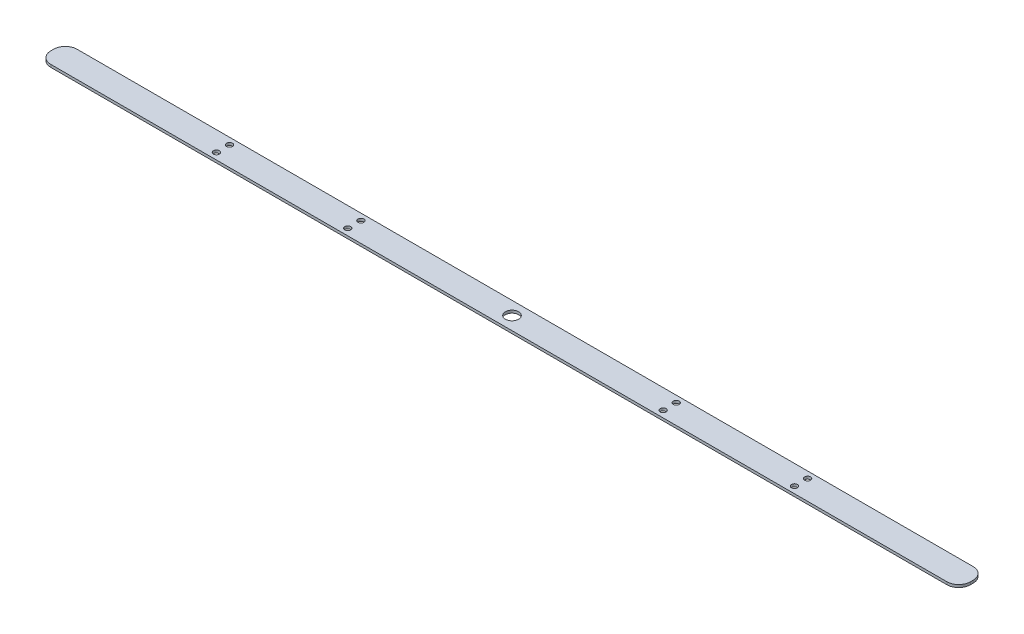
ISO-10303-21;
HEADER;
FILE_DESCRIPTION(('STEP AP214'),'2;1');
FILE_NAME('part.step','',(''),(''),'','','');
FILE_SCHEMA(('AUTOMOTIVE_DESIGN { 1 0 10303 214 1 1 1 1 }'));
ENDSEC;
DATA;
#1=APPLICATION_CONTEXT('core data for automotive mechanical design processes');
#2=APPLICATION_PROTOCOL_DEFINITION('international standard','automotive_design',2000,#1);
#3=PRODUCT_CONTEXT('',#1,'mechanical');
#4=PRODUCT('Part','Part','',(#3));
#5=PRODUCT_RELATED_PRODUCT_CATEGORY('part','',(#4));
#6=PRODUCT_DEFINITION_FORMATION('','',#4);
#7=PRODUCT_DEFINITION_CONTEXT('part definition',#1,'design');
#8=PRODUCT_DEFINITION('design','',#6,#7);
#9=PRODUCT_DEFINITION_SHAPE('','',#8);
#10=(LENGTH_UNIT() NAMED_UNIT(*) SI_UNIT(.MILLI.,.METRE.));
#11=(NAMED_UNIT(*) PLANE_ANGLE_UNIT() SI_UNIT($,.RADIAN.));
#12=(NAMED_UNIT(*) SI_UNIT($,.STERADIAN.) SOLID_ANGLE_UNIT());
#13=UNCERTAINTY_MEASURE_WITH_UNIT(LENGTH_MEASURE(1.E-05),#10,'distance_accuracy_value','');
#14=(GEOMETRIC_REPRESENTATION_CONTEXT(3) GLOBAL_UNCERTAINTY_ASSIGNED_CONTEXT((#13)) GLOBAL_UNIT_ASSIGNED_CONTEXT((#10,
#11,#12)) REPRESENTATION_CONTEXT('',''));
#15=CARTESIAN_POINT('',(0.,0.,0.));
#16=DIRECTION('',(0.,0.,1.));
#17=DIRECTION('',(1.,0.,0.));
#18=AXIS2_PLACEMENT_3D('',#15,#16,#17);
#19=CARTESIAN_POINT('',(0.,2.,0.));
#20=DIRECTION('',(1.,0.,0.));
#21=DIRECTION('',(0.,0.,-1.));
#22=AXIS2_PLACEMENT_3D('',#19,#20,#21);
#23=PLANE('',#22);
#24=DIRECTION('',(0.,0.,1.));
#25=VECTOR('',#24,1.);
#26=CARTESIAN_POINT('',(0.,0.,0.));
#27=LINE('',#26,#25);
#28=CARTESIAN_POINT('',(0.,0.,-11.));
#29=VERTEX_POINT('',#28);
#30=CARTESIAN_POINT('',(0.,0.,-9.));
#31=VERTEX_POINT('',#30);
#32=EDGE_CURVE('E142',#29,#31,#27,.T.);
#33=ORIENTED_EDGE('',*,*,#32,.T.);
#34=DIRECTION('',(0.,-1.,0.));
#35=VECTOR('',#34,1.);
#36=CARTESIAN_POINT('',(0.,2.,-9.));
#37=LINE('',#36,#35);
#38=CARTESIAN_POINT('',(0.,2.,-9.));
#39=VERTEX_POINT('',#38);
#40=EDGE_CURVE('E117',#31,#39,#37,.F.);
#41=ORIENTED_EDGE('',*,*,#40,.T.);
#42=DIRECTION('',(0.,0.,1.));
#43=VECTOR('',#42,1.);
#44=CARTESIAN_POINT('',(0.,2.,0.));
#45=LINE('',#44,#43);
#46=CARTESIAN_POINT('',(0.,2.,-11.));
#47=VERTEX_POINT('',#46);
#48=EDGE_CURVE('E155',#47,#39,#45,.T.);
#49=ORIENTED_EDGE('',*,*,#48,.F.);
#50=DIRECTION('',(0.,-1.,0.));
#51=VECTOR('',#50,1.);
#52=CARTESIAN_POINT('',(0.,2.,-11.));
#53=LINE('',#52,#51);
#54=EDGE_CURVE('E123',#47,#29,#53,.T.);
#55=ORIENTED_EDGE('',*,*,#54,.T.);
#56=EDGE_LOOP('',(#33,#41,#49,#55));
#57=FACE_BOUND('',#56,.T.);
#58=ADVANCED_FACE('F45',(#57),#23,.F.);
#59=CARTESIAN_POINT('',(0.,2.,0.));
#60=DIRECTION('',(0.,0.,-1.));
#61=DIRECTION('',(-1.,0.,0.));
#62=AXIS2_PLACEMENT_3D('',#59,#60,#61);
#63=PLANE('',#62);
#64=DIRECTION('',(1.,0.,0.));
#65=VECTOR('',#64,1.);
#66=CARTESIAN_POINT('',(0.,2.,0.));
#67=LINE('',#66,#65);
#68=CARTESIAN_POINT('',(9.,2.,0.));
#69=VERTEX_POINT('',#68);
#70=CARTESIAN_POINT('',(691.,2.,0.));
#71=VERTEX_POINT('',#70);
#72=EDGE_CURVE('E133',#69,#71,#67,.T.);
#73=ORIENTED_EDGE('',*,*,#72,.F.);
#74=DIRECTION('',(0.,-1.,0.));
#75=VECTOR('',#74,1.);
#76=CARTESIAN_POINT('',(9.,2.,0.));
#77=LINE('',#76,#75);
#78=CARTESIAN_POINT('',(9.,0.,0.));
#79=VERTEX_POINT('',#78);
#80=EDGE_CURVE('E116',#69,#79,#77,.T.);
#81=ORIENTED_EDGE('',*,*,#80,.T.);
#82=DIRECTION('',(1.,0.,0.));
#83=VECTOR('',#82,1.);
#84=CARTESIAN_POINT('',(0.,0.,0.));
#85=LINE('',#84,#83);
#86=CARTESIAN_POINT('',(691.,0.,0.));
#87=VERTEX_POINT('',#86);
#88=EDGE_CURVE('E130',#79,#87,#85,.T.);
#89=ORIENTED_EDGE('',*,*,#88,.T.);
#90=DIRECTION('',(0.,-1.,0.));
#91=VECTOR('',#90,1.);
#92=CARTESIAN_POINT('',(691.,2.,0.));
#93=LINE('',#92,#91);
#94=EDGE_CURVE('E136',#87,#71,#93,.F.);
#95=ORIENTED_EDGE('',*,*,#94,.T.);
#96=EDGE_LOOP('',(#73,#81,#89,#95));
#97=FACE_BOUND('',#96,.T.);
#98=ADVANCED_FACE('F129',(#97),#63,.F.);
#99=CARTESIAN_POINT('',(700.,2.,0.));
#100=DIRECTION('',(-1.,0.,0.));
#101=DIRECTION('',(0.,0.,1.));
#102=AXIS2_PLACEMENT_3D('',#99,#100,#101);
#103=PLANE('',#102);
#104=DIRECTION('',(0.,0.,-1.));
#105=VECTOR('',#104,1.);
#106=CARTESIAN_POINT('',(700.,0.,0.));
#107=LINE('',#106,#105);
#108=CARTESIAN_POINT('',(700.,0.,-9.));
#109=VERTEX_POINT('',#108);
#110=CARTESIAN_POINT('',(700.,0.,-11.));
#111=VERTEX_POINT('',#110);
#112=EDGE_CURVE('E141',#109,#111,#107,.T.);
#113=ORIENTED_EDGE('',*,*,#112,.T.);
#114=DIRECTION('',(0.,-1.,0.));
#115=VECTOR('',#114,1.);
#116=CARTESIAN_POINT('',(700.,2.,-11.));
#117=LINE('',#116,#115);
#118=CARTESIAN_POINT('',(700.,2.,-11.));
#119=VERTEX_POINT('',#118);
#120=EDGE_CURVE('E11',#111,#119,#117,.F.);
#121=ORIENTED_EDGE('',*,*,#120,.T.);
#122=DIRECTION('',(0.,0.,-1.));
#123=VECTOR('',#122,1.);
#124=CARTESIAN_POINT('',(700.,2.,0.));
#125=LINE('',#124,#123);
#126=CARTESIAN_POINT('',(700.,2.,-9.));
#127=VERTEX_POINT('',#126);
#128=EDGE_CURVE('E194',#127,#119,#125,.T.);
#129=ORIENTED_EDGE('',*,*,#128,.F.);
#130=DIRECTION('',(0.,-1.,0.));
#131=VECTOR('',#130,1.);
#132=CARTESIAN_POINT('',(700.,2.,-9.));
#133=LINE('',#132,#131);
#134=EDGE_CURVE('E54',#127,#109,#133,.T.);
#135=ORIENTED_EDGE('',*,*,#134,.T.);
#136=EDGE_LOOP('',(#113,#121,#129,#135));
#137=FACE_BOUND('',#136,.T.);
#138=ADVANCED_FACE('F192',(#137),#103,.F.);
#139=CARTESIAN_POINT('',(0.,2.,-20.));
#140=DIRECTION('',(0.,0.,1.));
#141=DIRECTION('',(1.,0.,0.));
#142=AXIS2_PLACEMENT_3D('',#139,#140,#141);
#143=PLANE('',#142);
#144=DIRECTION('',(-1.,0.,0.));
#145=VECTOR('',#144,1.);
#146=CARTESIAN_POINT('',(0.,0.,-20.));
#147=LINE('',#146,#145);
#148=CARTESIAN_POINT('',(691.,0.,-20.));
#149=VERTEX_POINT('',#148);
#150=CARTESIAN_POINT('',(9.,0.,-20.));
#151=VERTEX_POINT('',#150);
#152=EDGE_CURVE('E147',#149,#151,#147,.T.);
#153=ORIENTED_EDGE('',*,*,#152,.T.);
#154=DIRECTION('',(0.,-1.,0.));
#155=VECTOR('',#154,1.);
#156=CARTESIAN_POINT('',(9.,2.,-20.));
#157=LINE('',#156,#155);
#158=CARTESIAN_POINT('',(9.,2.,-20.));
#159=VERTEX_POINT('',#158);
#160=EDGE_CURVE('E61',#151,#159,#157,.F.);
#161=ORIENTED_EDGE('',*,*,#160,.T.);
#162=DIRECTION('',(-1.,0.,0.));
#163=VECTOR('',#162,1.);
#164=CARTESIAN_POINT('',(0.,2.,-20.));
#165=LINE('',#164,#163);
#166=CARTESIAN_POINT('',(691.,2.,-20.));
#167=VERTEX_POINT('',#166);
#168=EDGE_CURVE('E157',#167,#159,#165,.T.);
#169=ORIENTED_EDGE('',*,*,#168,.F.);
#170=DIRECTION('',(0.,-1.,0.));
#171=VECTOR('',#170,1.);
#172=CARTESIAN_POINT('',(691.,2.,-20.));
#173=LINE('',#172,#171);
#174=EDGE_CURVE('E182',#167,#149,#173,.T.);
#175=ORIENTED_EDGE('',*,*,#174,.T.);
#176=EDGE_LOOP('',(#153,#161,#169,#175));
#177=FACE_BOUND('',#176,.T.);
#178=ADVANCED_FACE('F201',(#177),#143,.F.);
#179=CARTESIAN_POINT('',(0.,2.,0.));
#180=DIRECTION('',(0.,-1.,0.));
#181=DIRECTION('',(0.,0.,-1.));
#182=AXIS2_PLACEMENT_3D('',#179,#180,#181);
#183=PLANE('',#182);
#184=CARTESIAN_POINT('',(570.,2.,-14.9999999999951));
#185=DIRECTION('',(0.,1.,0.));
#186=DIRECTION('',(0.,0.,-1.));
#187=AXIS2_PLACEMENT_3D('',#184,#185,#186);
#188=CIRCLE('',#187,2.25000000000003);
#189=CARTESIAN_POINT('',(570.,2.,-17.2499999999951));
#190=VERTEX_POINT('',#189);
#191=EDGE_CURVE('E224',#190,#190,#188,.T.);
#192=ORIENTED_EDGE('',*,*,#191,.F.);
#193=EDGE_LOOP('',(#192));
#194=FACE_BOUND('',#193,.T.);
#195=CARTESIAN_POINT('',(570.,2.,-4.99999999999512));
#196=DIRECTION('',(0.,1.,0.));
#197=DIRECTION('',(0.,0.,-1.));
#198=AXIS2_PLACEMENT_3D('',#195,#196,#197);
#199=CIRCLE('',#198,2.25000000000003);
#200=CARTESIAN_POINT('',(570.,2.,-7.24999999999514));
#201=VERTEX_POINT('',#200);
#202=EDGE_CURVE('E232',#201,#201,#199,.T.);
#203=ORIENTED_EDGE('',*,*,#202,.F.);
#204=EDGE_LOOP('',(#203));
#205=FACE_BOUND('',#204,.T.);
#206=CARTESIAN_POINT('',(470.,2.,-4.99999999999734));
#207=DIRECTION('',(0.,1.,0.));
#208=DIRECTION('',(0.,0.,-1.));
#209=AXIS2_PLACEMENT_3D('',#206,#207,#208);
#210=CIRCLE('',#209,2.24999999999997);
#211=CARTESIAN_POINT('',(470.,2.,-7.24999999999731));
#212=VERTEX_POINT('',#211);
#213=EDGE_CURVE('E240',#212,#212,#210,.T.);
#214=ORIENTED_EDGE('',*,*,#213,.F.);
#215=EDGE_LOOP('',(#214));
#216=FACE_BOUND('',#215,.T.);
#217=CARTESIAN_POINT('',(470.,2.,-14.9999999999973));
#218=DIRECTION('',(0.,1.,0.));
#219=DIRECTION('',(0.,0.,-1.));
#220=AXIS2_PLACEMENT_3D('',#217,#218,#219);
#221=CIRCLE('',#220,2.24999999999997);
#222=CARTESIAN_POINT('',(470.,2.,-17.2499999999973));
#223=VERTEX_POINT('',#222);
#224=EDGE_CURVE('E248',#223,#223,#221,.T.);
#225=ORIENTED_EDGE('',*,*,#224,.F.);
#226=EDGE_LOOP('',(#225));
#227=FACE_BOUND('',#226,.T.);
#228=CARTESIAN_POINT('',(230.,2.,-5.));
#229=DIRECTION('',(0.,1.,0.));
#230=DIRECTION('',(0.,0.,1.));
#231=AXIS2_PLACEMENT_3D('',#228,#229,#230);
#232=CIRCLE('',#231,2.24999999999998);
#233=CARTESIAN_POINT('',(230.,2.,-2.75000000000002));
#234=VERTEX_POINT('',#233);
#235=EDGE_CURVE('E256',#234,#234,#232,.T.);
#236=ORIENTED_EDGE('',*,*,#235,.F.);
#237=EDGE_LOOP('',(#236));
#238=FACE_BOUND('',#237,.T.);
#239=CARTESIAN_POINT('',(130.,2.,-5.));
#240=DIRECTION('',(0.,1.,0.));
#241=DIRECTION('',(0.,0.,1.));
#242=AXIS2_PLACEMENT_3D('',#239,#240,#241);
#243=CIRCLE('',#242,2.25000000000004);
#244=CARTESIAN_POINT('',(130.,2.,-2.74999999999996));
#245=VERTEX_POINT('',#244);
#246=EDGE_CURVE('E264',#245,#245,#243,.T.);
#247=ORIENTED_EDGE('',*,*,#246,.F.);
#248=EDGE_LOOP('',(#247));
#249=FACE_BOUND('',#248,.T.);
#250=CARTESIAN_POINT('',(230.,2.,-15.));
#251=DIRECTION('',(0.,1.,0.));
#252=DIRECTION('',(0.,0.,1.));
#253=AXIS2_PLACEMENT_3D('',#250,#251,#252);
#254=CIRCLE('',#253,2.24999999999998);
#255=CARTESIAN_POINT('',(230.,2.,-12.75));
#256=VERTEX_POINT('',#255);
#257=EDGE_CURVE('E272',#256,#256,#254,.T.);
#258=ORIENTED_EDGE('',*,*,#257,.F.);
#259=EDGE_LOOP('',(#258));
#260=FACE_BOUND('',#259,.T.);
#261=CARTESIAN_POINT('',(130.,2.,-15.));
#262=DIRECTION('',(0.,1.,0.));
#263=DIRECTION('',(0.,0.,1.));
#264=AXIS2_PLACEMENT_3D('',#261,#262,#263);
#265=CIRCLE('',#264,2.25000000000004);
#266=CARTESIAN_POINT('',(130.,2.,-12.75));
#267=VERTEX_POINT('',#266);
#268=EDGE_CURVE('E216',#267,#267,#265,.T.);
#269=ORIENTED_EDGE('',*,*,#268,.F.);
#270=EDGE_LOOP('',(#269));
#271=FACE_BOUND('',#270,.T.);
#272=CARTESIAN_POINT('',(350.,2.,-10.));
#273=DIRECTION('',(0.,1.,0.));
#274=DIRECTION('',(0.,0.,1.));
#275=AXIS2_PLACEMENT_3D('',#272,#273,#274);
#276=CIRCLE('',#275,4.99999999999999);
#277=CARTESIAN_POINT('',(350.,2.,-5.00000000000001));
#278=VERTEX_POINT('',#277);
#279=EDGE_CURVE('E212',#278,#278,#276,.T.);
#280=ORIENTED_EDGE('',*,*,#279,.F.);
#281=EDGE_LOOP('',(#280));
#282=FACE_BOUND('',#281,.T.);
#283=ORIENTED_EDGE('',*,*,#48,.T.);
#284=CARTESIAN_POINT('',(9.,2.,-9.));
#285=DIRECTION('',(0.,-1.,0.));
#286=DIRECTION('',(0.,0.,-1.));
#287=AXIS2_PLACEMENT_3D('',#284,#285,#286);
#288=CIRCLE('',#287,9.);
#289=EDGE_CURVE('E179',#39,#69,#288,.F.);
#290=ORIENTED_EDGE('',*,*,#289,.T.);
#291=ORIENTED_EDGE('',*,*,#72,.T.);
#292=CARTESIAN_POINT('',(691.,2.,-9.));
#293=DIRECTION('',(0.,-1.,0.));
#294=DIRECTION('',(0.,0.,-1.));
#295=AXIS2_PLACEMENT_3D('',#292,#293,#294);
#296=CIRCLE('',#295,9.);
#297=EDGE_CURVE('E171',#71,#127,#296,.F.);
#298=ORIENTED_EDGE('',*,*,#297,.T.);
#299=ORIENTED_EDGE('',*,*,#128,.T.);
#300=CARTESIAN_POINT('',(691.,2.,-11.));
#301=DIRECTION('',(0.,-1.,0.));
#302=DIRECTION('',(0.,0.,-1.));
#303=AXIS2_PLACEMENT_3D('',#300,#301,#302);
#304=CIRCLE('',#303,9.);
#305=EDGE_CURVE('E68',#119,#167,#304,.F.);
#306=ORIENTED_EDGE('',*,*,#305,.T.);
#307=ORIENTED_EDGE('',*,*,#168,.T.);
#308=CARTESIAN_POINT('',(9.,2.,-11.));
#309=DIRECTION('',(0.,-1.,0.));
#310=DIRECTION('',(0.,0.,-1.));
#311=AXIS2_PLACEMENT_3D('',#308,#309,#310);
#312=CIRCLE('',#311,9.);
#313=EDGE_CURVE('E176',#159,#47,#312,.F.);
#314=ORIENTED_EDGE('',*,*,#313,.T.);
#315=EDGE_LOOP('',(#283,#290,#291,#298,#299,#306,#307,#314));
#316=FACE_BOUND('',#315,.T.);
#317=ADVANCED_FACE('F286',(#194,#205,#216,#227,#238,#249,#260,#271,#282,#316),#183,.F.);
#318=CARTESIAN_POINT('',(0.,0.,0.));
#319=DIRECTION('',(0.,-1.,0.));
#320=DIRECTION('',(0.,0.,-1.));
#321=AXIS2_PLACEMENT_3D('',#318,#319,#320);
#322=PLANE('',#321);
#323=CARTESIAN_POINT('',(570.,0.,-14.9999999999951));
#324=DIRECTION('',(0.,1.,0.));
#325=DIRECTION('',(0.,0.,-1.));
#326=AXIS2_PLACEMENT_3D('',#323,#324,#325);
#327=CIRCLE('',#326,2.25000000000003);
#328=CARTESIAN_POINT('',(570.,0.,-17.2499999999951));
#329=VERTEX_POINT('',#328);
#330=EDGE_CURVE('E220',#329,#329,#327,.T.);
#331=ORIENTED_EDGE('',*,*,#330,.T.);
#332=EDGE_LOOP('',(#331));
#333=FACE_BOUND('',#332,.T.);
#334=CARTESIAN_POINT('',(570.,0.,-4.99999999999512));
#335=DIRECTION('',(0.,1.,0.));
#336=DIRECTION('',(0.,0.,-1.));
#337=AXIS2_PLACEMENT_3D('',#334,#335,#336);
#338=CIRCLE('',#337,2.25000000000003);
#339=CARTESIAN_POINT('',(570.,0.,-7.24999999999514));
#340=VERTEX_POINT('',#339);
#341=EDGE_CURVE('E228',#340,#340,#338,.T.);
#342=ORIENTED_EDGE('',*,*,#341,.T.);
#343=EDGE_LOOP('',(#342));
#344=FACE_BOUND('',#343,.T.);
#345=CARTESIAN_POINT('',(470.,0.,-4.99999999999734));
#346=DIRECTION('',(0.,1.,0.));
#347=DIRECTION('',(0.,0.,-1.));
#348=AXIS2_PLACEMENT_3D('',#345,#346,#347);
#349=CIRCLE('',#348,2.24999999999997);
#350=CARTESIAN_POINT('',(470.,0.,-7.24999999999731));
#351=VERTEX_POINT('',#350);
#352=EDGE_CURVE('E236',#351,#351,#349,.T.);
#353=ORIENTED_EDGE('',*,*,#352,.T.);
#354=EDGE_LOOP('',(#353));
#355=FACE_BOUND('',#354,.T.);
#356=CARTESIAN_POINT('',(470.,0.,-14.9999999999973));
#357=DIRECTION('',(0.,1.,0.));
#358=DIRECTION('',(0.,0.,-1.));
#359=AXIS2_PLACEMENT_3D('',#356,#357,#358);
#360=CIRCLE('',#359,2.24999999999997);
#361=CARTESIAN_POINT('',(470.,0.,-17.2499999999973));
#362=VERTEX_POINT('',#361);
#363=EDGE_CURVE('E244',#362,#362,#360,.T.);
#364=ORIENTED_EDGE('',*,*,#363,.T.);
#365=EDGE_LOOP('',(#364));
#366=FACE_BOUND('',#365,.T.);
#367=CARTESIAN_POINT('',(230.,0.,-5.));
#368=DIRECTION('',(0.,1.,0.));
#369=DIRECTION('',(0.,0.,1.));
#370=AXIS2_PLACEMENT_3D('',#367,#368,#369);
#371=CIRCLE('',#370,2.24999999999998);
#372=CARTESIAN_POINT('',(230.,0.,-2.75000000000002));
#373=VERTEX_POINT('',#372);
#374=EDGE_CURVE('E252',#373,#373,#371,.T.);
#375=ORIENTED_EDGE('',*,*,#374,.T.);
#376=EDGE_LOOP('',(#375));
#377=FACE_BOUND('',#376,.T.);
#378=CARTESIAN_POINT('',(130.,0.,-5.));
#379=DIRECTION('',(0.,1.,0.));
#380=DIRECTION('',(0.,0.,1.));
#381=AXIS2_PLACEMENT_3D('',#378,#379,#380);
#382=CIRCLE('',#381,2.25000000000004);
#383=CARTESIAN_POINT('',(130.,0.,-2.74999999999996));
#384=VERTEX_POINT('',#383);
#385=EDGE_CURVE('E260',#384,#384,#382,.T.);
#386=ORIENTED_EDGE('',*,*,#385,.T.);
#387=EDGE_LOOP('',(#386));
#388=FACE_BOUND('',#387,.T.);
#389=CARTESIAN_POINT('',(230.,0.,-15.));
#390=DIRECTION('',(0.,1.,0.));
#391=DIRECTION('',(0.,0.,1.));
#392=AXIS2_PLACEMENT_3D('',#389,#390,#391);
#393=CIRCLE('',#392,2.24999999999998);
#394=CARTESIAN_POINT('',(230.,0.,-12.75));
#395=VERTEX_POINT('',#394);
#396=EDGE_CURVE('E268',#395,#395,#393,.T.);
#397=ORIENTED_EDGE('',*,*,#396,.T.);
#398=EDGE_LOOP('',(#397));
#399=FACE_BOUND('',#398,.T.);
#400=CARTESIAN_POINT('',(130.,0.,-15.));
#401=DIRECTION('',(0.,1.,0.));
#402=DIRECTION('',(0.,0.,1.));
#403=AXIS2_PLACEMENT_3D('',#400,#401,#402);
#404=CIRCLE('',#403,2.25000000000004);
#405=CARTESIAN_POINT('',(130.,0.,-12.75));
#406=VERTEX_POINT('',#405);
#407=EDGE_CURVE('E276',#406,#406,#404,.T.);
#408=ORIENTED_EDGE('',*,*,#407,.T.);
#409=EDGE_LOOP('',(#408));
#410=FACE_BOUND('',#409,.T.);
#411=CARTESIAN_POINT('',(350.,0.,-10.));
#412=DIRECTION('',(0.,1.,0.));
#413=DIRECTION('',(0.,0.,1.));
#414=AXIS2_PLACEMENT_3D('',#411,#412,#413);
#415=CIRCLE('',#414,4.99999999999999);
#416=CARTESIAN_POINT('',(350.,0.,-5.00000000000001));
#417=VERTEX_POINT('',#416);
#418=EDGE_CURVE('E149',#417,#417,#415,.T.);
#419=ORIENTED_EDGE('',*,*,#418,.T.);
#420=EDGE_LOOP('',(#419));
#421=FACE_BOUND('',#420,.T.);
#422=ORIENTED_EDGE('',*,*,#88,.F.);
#423=CARTESIAN_POINT('',(9.,0.,-9.));
#424=DIRECTION('',(0.,-1.,0.));
#425=DIRECTION('',(0.,0.,-1.));
#426=AXIS2_PLACEMENT_3D('',#423,#424,#425);
#427=CIRCLE('',#426,9.);
#428=EDGE_CURVE('E112',#79,#31,#427,.T.);
#429=ORIENTED_EDGE('',*,*,#428,.T.);
#430=ORIENTED_EDGE('',*,*,#32,.F.);
#431=CARTESIAN_POINT('',(9.,0.,-11.));
#432=DIRECTION('',(0.,-1.,0.));
#433=DIRECTION('',(0.,0.,-1.));
#434=AXIS2_PLACEMENT_3D('',#431,#432,#433);
#435=CIRCLE('',#434,9.);
#436=EDGE_CURVE('E124',#29,#151,#435,.T.);
#437=ORIENTED_EDGE('',*,*,#436,.T.);
#438=ORIENTED_EDGE('',*,*,#152,.F.);
#439=CARTESIAN_POINT('',(691.,0.,-11.));
#440=DIRECTION('',(0.,-1.,0.));
#441=DIRECTION('',(0.,0.,-1.));
#442=AXIS2_PLACEMENT_3D('',#439,#440,#441);
#443=CIRCLE('',#442,9.);
#444=EDGE_CURVE('E161',#149,#111,#443,.T.);
#445=ORIENTED_EDGE('',*,*,#444,.T.);
#446=ORIENTED_EDGE('',*,*,#112,.F.);
#447=CARTESIAN_POINT('',(691.,0.,-9.));
#448=DIRECTION('',(0.,-1.,0.));
#449=DIRECTION('',(0.,0.,-1.));
#450=AXIS2_PLACEMENT_3D('',#447,#448,#449);
#451=CIRCLE('',#450,9.);
#452=EDGE_CURVE('E135',#109,#87,#451,.T.);
#453=ORIENTED_EDGE('',*,*,#452,.T.);
#454=EDGE_LOOP('',(#422,#429,#430,#437,#438,#445,#446,#453));
#455=FACE_BOUND('',#454,.T.);
#456=ADVANCED_FACE('F138',(#333,#344,#355,#366,#377,#388,#399,#410,#421,#455),#322,.T.);
#457=CARTESIAN_POINT('',(9.,2.,-9.));
#458=DIRECTION('',(0.,-1.,0.));
#459=DIRECTION('',(0.,0.,-1.));
#460=AXIS2_PLACEMENT_3D('',#457,#458,#459);
#461=CYLINDRICAL_SURFACE('',#460,9.);
#462=ORIENTED_EDGE('',*,*,#289,.F.);
#463=ORIENTED_EDGE('',*,*,#40,.F.);
#464=ORIENTED_EDGE('',*,*,#428,.F.);
#465=ORIENTED_EDGE('',*,*,#80,.F.);
#466=EDGE_LOOP('',(#462,#463,#464,#465));
#467=FACE_BOUND('',#466,.T.);
#468=ADVANCED_FACE('F115',(#467),#461,.T.);
#469=CARTESIAN_POINT('',(9.,2.,-11.));
#470=DIRECTION('',(0.,-1.,0.));
#471=DIRECTION('',(0.,0.,-1.));
#472=AXIS2_PLACEMENT_3D('',#469,#470,#471);
#473=CYLINDRICAL_SURFACE('',#472,9.);
#474=ORIENTED_EDGE('',*,*,#313,.F.);
#475=ORIENTED_EDGE('',*,*,#160,.F.);
#476=ORIENTED_EDGE('',*,*,#436,.F.);
#477=ORIENTED_EDGE('',*,*,#54,.F.);
#478=EDGE_LOOP('',(#474,#475,#476,#477));
#479=FACE_BOUND('',#478,.T.);
#480=ADVANCED_FACE('F296',(#479),#473,.T.);
#481=CARTESIAN_POINT('',(691.,2.,-11.));
#482=DIRECTION('',(0.,-1.,0.));
#483=DIRECTION('',(0.,0.,-1.));
#484=AXIS2_PLACEMENT_3D('',#481,#482,#483);
#485=CYLINDRICAL_SURFACE('',#484,9.);
#486=ORIENTED_EDGE('',*,*,#305,.F.);
#487=ORIENTED_EDGE('',*,*,#120,.F.);
#488=ORIENTED_EDGE('',*,*,#444,.F.);
#489=ORIENTED_EDGE('',*,*,#174,.F.);
#490=EDGE_LOOP('',(#486,#487,#488,#489));
#491=FACE_BOUND('',#490,.T.);
#492=ADVANCED_FACE('F200',(#491),#485,.T.);
#493=CARTESIAN_POINT('',(691.,2.,-9.));
#494=DIRECTION('',(0.,-1.,0.));
#495=DIRECTION('',(0.,0.,-1.));
#496=AXIS2_PLACEMENT_3D('',#493,#494,#495);
#497=CYLINDRICAL_SURFACE('',#496,9.);
#498=ORIENTED_EDGE('',*,*,#297,.F.);
#499=ORIENTED_EDGE('',*,*,#94,.F.);
#500=ORIENTED_EDGE('',*,*,#452,.F.);
#501=ORIENTED_EDGE('',*,*,#134,.F.);
#502=EDGE_LOOP('',(#498,#499,#500,#501));
#503=FACE_BOUND('',#502,.T.);
#504=ADVANCED_FACE('F47',(#503),#497,.T.);
#505=CARTESIAN_POINT('',(350.,0.,-10.));
#506=DIRECTION('',(0.,1.,0.));
#507=DIRECTION('',(0.,0.,1.));
#508=AXIS2_PLACEMENT_3D('',#505,#506,#507);
#509=CYLINDRICAL_SURFACE('',#508,4.99999999999999);
#510=ORIENTED_EDGE('',*,*,#418,.F.);
#511=EDGE_LOOP('',(#510));
#512=FACE_BOUND('',#511,.T.);
#513=ORIENTED_EDGE('',*,*,#279,.T.);
#514=EDGE_LOOP('',(#513));
#515=FACE_BOUND('',#514,.T.);
#516=ADVANCED_FACE('F318',(#512,#515),#509,.F.);
#517=CARTESIAN_POINT('',(130.,0.,-15.));
#518=DIRECTION('',(0.,1.,0.));
#519=DIRECTION('',(0.,0.,1.));
#520=AXIS2_PLACEMENT_3D('',#517,#518,#519);
#521=CYLINDRICAL_SURFACE('',#520,2.25000000000004);
#522=ORIENTED_EDGE('',*,*,#407,.F.);
#523=EDGE_LOOP('',(#522));
#524=FACE_BOUND('',#523,.T.);
#525=ORIENTED_EDGE('',*,*,#268,.T.);
#526=EDGE_LOOP('',(#525));
#527=FACE_BOUND('',#526,.T.);
#528=ADVANCED_FACE('F284',(#524,#527),#521,.F.);
#529=CARTESIAN_POINT('',(230.,0.,-15.));
#530=DIRECTION('',(0.,1.,0.));
#531=DIRECTION('',(0.,0.,1.));
#532=AXIS2_PLACEMENT_3D('',#529,#530,#531);
#533=CYLINDRICAL_SURFACE('',#532,2.24999999999998);
#534=ORIENTED_EDGE('',*,*,#396,.F.);
#535=EDGE_LOOP('',(#534));
#536=FACE_BOUND('',#535,.T.);
#537=ORIENTED_EDGE('',*,*,#257,.T.);
#538=EDGE_LOOP('',(#537));
#539=FACE_BOUND('',#538,.T.);
#540=ADVANCED_FACE('F345',(#536,#539),#533,.F.);
#541=CARTESIAN_POINT('',(130.,0.,-5.));
#542=DIRECTION('',(0.,1.,0.));
#543=DIRECTION('',(0.,0.,1.));
#544=AXIS2_PLACEMENT_3D('',#541,#542,#543);
#545=CYLINDRICAL_SURFACE('',#544,2.25000000000004);
#546=ORIENTED_EDGE('',*,*,#385,.F.);
#547=EDGE_LOOP('',(#546));
#548=FACE_BOUND('',#547,.T.);
#549=ORIENTED_EDGE('',*,*,#246,.T.);
#550=EDGE_LOOP('',(#549));
#551=FACE_BOUND('',#550,.T.);
#552=ADVANCED_FACE('F341',(#548,#551),#545,.F.);
#553=CARTESIAN_POINT('',(230.,0.,-5.));
#554=DIRECTION('',(0.,1.,0.));
#555=DIRECTION('',(0.,0.,1.));
#556=AXIS2_PLACEMENT_3D('',#553,#554,#555);
#557=CYLINDRICAL_SURFACE('',#556,2.24999999999998);
#558=ORIENTED_EDGE('',*,*,#374,.F.);
#559=EDGE_LOOP('',(#558));
#560=FACE_BOUND('',#559,.T.);
#561=ORIENTED_EDGE('',*,*,#235,.T.);
#562=EDGE_LOOP('',(#561));
#563=FACE_BOUND('',#562,.T.);
#564=ADVANCED_FACE('F337',(#560,#563),#557,.F.);
#565=CARTESIAN_POINT('',(470.,0.,-14.9999999999973));
#566=DIRECTION('',(0.,1.,0.));
#567=DIRECTION('',(0.,0.,1.));
#568=AXIS2_PLACEMENT_3D('',#565,#566,#567);
#569=CYLINDRICAL_SURFACE('',#568,2.24999999999997);
#570=ORIENTED_EDGE('',*,*,#363,.F.);
#571=EDGE_LOOP('',(#570));
#572=FACE_BOUND('',#571,.T.);
#573=ORIENTED_EDGE('',*,*,#224,.T.);
#574=EDGE_LOOP('',(#573));
#575=FACE_BOUND('',#574,.T.);
#576=ADVANCED_FACE('F333',(#572,#575),#569,.F.);
#577=CARTESIAN_POINT('',(470.,0.,-4.99999999999734));
#578=DIRECTION('',(0.,1.,0.));
#579=DIRECTION('',(0.,0.,1.));
#580=AXIS2_PLACEMENT_3D('',#577,#578,#579);
#581=CYLINDRICAL_SURFACE('',#580,2.24999999999997);
#582=ORIENTED_EDGE('',*,*,#352,.F.);
#583=EDGE_LOOP('',(#582));
#584=FACE_BOUND('',#583,.T.);
#585=ORIENTED_EDGE('',*,*,#213,.T.);
#586=EDGE_LOOP('',(#585));
#587=FACE_BOUND('',#586,.T.);
#588=ADVANCED_FACE('F329',(#584,#587),#581,.F.);
#589=CARTESIAN_POINT('',(570.,0.,-4.99999999999512));
#590=DIRECTION('',(0.,1.,0.));
#591=DIRECTION('',(0.,0.,1.));
#592=AXIS2_PLACEMENT_3D('',#589,#590,#591);
#593=CYLINDRICAL_SURFACE('',#592,2.25000000000003);
#594=ORIENTED_EDGE('',*,*,#341,.F.);
#595=EDGE_LOOP('',(#594));
#596=FACE_BOUND('',#595,.T.);
#597=ORIENTED_EDGE('',*,*,#202,.T.);
#598=EDGE_LOOP('',(#597));
#599=FACE_BOUND('',#598,.T.);
#600=ADVANCED_FACE('F325',(#596,#599),#593,.F.);
#601=CARTESIAN_POINT('',(570.,0.,-14.9999999999951));
#602=DIRECTION('',(0.,1.,0.));
#603=DIRECTION('',(0.,0.,1.));
#604=AXIS2_PLACEMENT_3D('',#601,#602,#603);
#605=CYLINDRICAL_SURFACE('',#604,2.25000000000003);
#606=ORIENTED_EDGE('',*,*,#330,.F.);
#607=EDGE_LOOP('',(#606));
#608=FACE_BOUND('',#607,.T.);
#609=ORIENTED_EDGE('',*,*,#191,.T.);
#610=EDGE_LOOP('',(#609));
#611=FACE_BOUND('',#610,.T.);
#612=ADVANCED_FACE('F322',(#608,#611),#605,.F.);
#613=CLOSED_SHELL('',(#58,#98,#138,#178,#317,#456,#468,#480,#492,#504,#516,#528,#540,#552,#564,
#576,#588,#600,#612));
#614=MANIFOLD_SOLID_BREP('B2',#613);
#615=ADVANCED_BREP_SHAPE_REPRESENTATION('',(#18,#614),#14);
#616=SHAPE_DEFINITION_REPRESENTATION(#9,#615);
ENDSEC;
END-ISO-10303-21;
